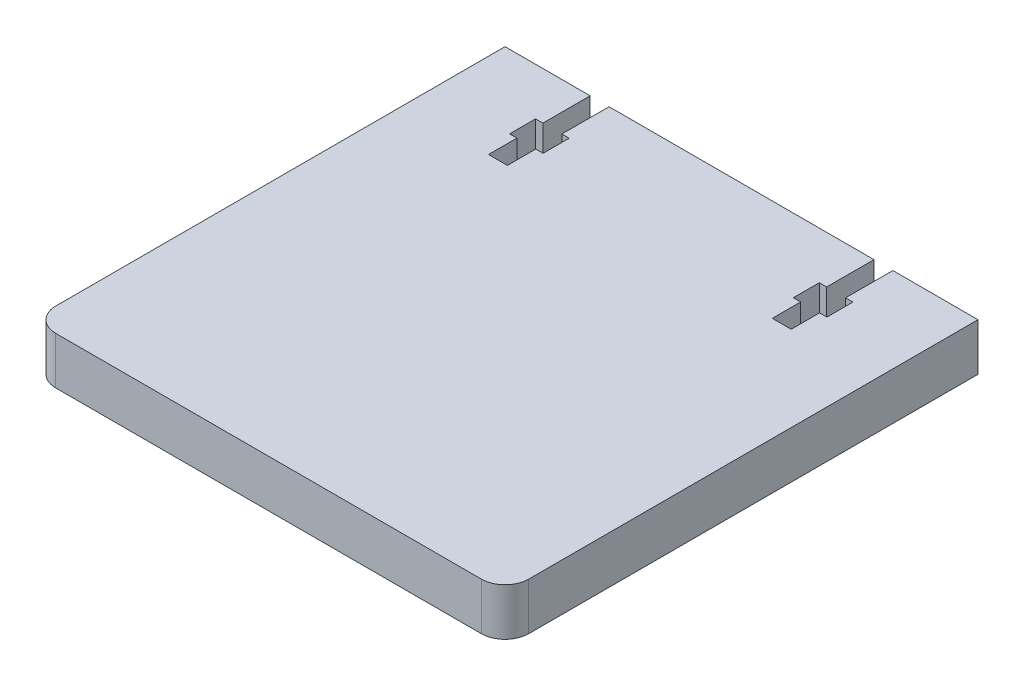
ISO-10303-21;
HEADER;
FILE_DESCRIPTION(('STEP AP214'),'2;1');
FILE_NAME('part.step','',(''),(''),'','','');
FILE_SCHEMA(('AUTOMOTIVE_DESIGN { 1 0 10303 214 1 1 1 1 }'));
ENDSEC;
DATA;
#1=APPLICATION_CONTEXT('core data for automotive mechanical design processes');
#2=APPLICATION_PROTOCOL_DEFINITION('international standard','automotive_design',2000,#1);
#3=PRODUCT_CONTEXT('',#1,'mechanical');
#4=PRODUCT('Part','Part','',(#3));
#5=PRODUCT_RELATED_PRODUCT_CATEGORY('part','',(#4));
#6=PRODUCT_DEFINITION_FORMATION('','',#4);
#7=PRODUCT_DEFINITION_CONTEXT('part definition',#1,'design');
#8=PRODUCT_DEFINITION('design','',#6,#7);
#9=PRODUCT_DEFINITION_SHAPE('','',#8);
#10=(LENGTH_UNIT() NAMED_UNIT(*) SI_UNIT(.MILLI.,.METRE.));
#11=(NAMED_UNIT(*) PLANE_ANGLE_UNIT() SI_UNIT($,.RADIAN.));
#12=(NAMED_UNIT(*) SI_UNIT($,.STERADIAN.) SOLID_ANGLE_UNIT());
#13=UNCERTAINTY_MEASURE_WITH_UNIT(LENGTH_MEASURE(1.E-05),#10,'distance_accuracy_value','');
#14=(GEOMETRIC_REPRESENTATION_CONTEXT(3) GLOBAL_UNCERTAINTY_ASSIGNED_CONTEXT((#13)) GLOBAL_UNIT_ASSIGNED_CONTEXT((#10,
#11,#12)) REPRESENTATION_CONTEXT('',''));
#15=CARTESIAN_POINT('',(0.,0.,0.));
#16=DIRECTION('',(0.,0.,1.));
#17=DIRECTION('',(1.,0.,0.));
#18=AXIS2_PLACEMENT_3D('',#15,#16,#17);
#19=CARTESIAN_POINT('',(0.,0.,100.));
#20=DIRECTION('',(0.,1.,0.));
#21=DIRECTION('',(0.,0.,1.));
#22=AXIS2_PLACEMENT_3D('',#19,#20,#21);
#23=PLANE('',#22);
#24=DIRECTION('',(0.,0.,-1.));
#25=VECTOR('',#24,1.);
#26=CARTESIAN_POINT('',(100.,0.,100.));
#27=LINE('',#26,#25);
#28=CARTESIAN_POINT('',(100.,0.,95.));
#29=VERTEX_POINT('',#28);
#30=CARTESIAN_POINT('',(100.,0.,0.));
#31=VERTEX_POINT('',#30);
#32=EDGE_CURVE('E424',#29,#31,#27,.T.);
#33=ORIENTED_EDGE('',*,*,#32,.F.);
#34=CARTESIAN_POINT('',(95.,0.,95.));
#35=DIRECTION('',(0.,1.,0.));
#36=DIRECTION('',(0.,0.,1.));
#37=AXIS2_PLACEMENT_3D('',#34,#35,#36);
#38=CIRCLE('',#37,5.);
#39=CARTESIAN_POINT('',(95.,0.,100.));
#40=VERTEX_POINT('',#39);
#41=EDGE_CURVE('E12',#29,#40,#38,.F.);
#42=ORIENTED_EDGE('',*,*,#41,.T.);
#43=DIRECTION('',(1.,0.,0.));
#44=VECTOR('',#43,1.);
#45=CARTESIAN_POINT('',(0.,0.,100.));
#46=LINE('',#45,#44);
#47=CARTESIAN_POINT('',(5.,0.,100.));
#48=VERTEX_POINT('',#47);
#49=EDGE_CURVE('E417',#48,#40,#46,.T.);
#50=ORIENTED_EDGE('',*,*,#49,.F.);
#51=CARTESIAN_POINT('',(5.,0.,95.));
#52=DIRECTION('',(0.,1.,0.));
#53=DIRECTION('',(0.,0.,1.));
#54=AXIS2_PLACEMENT_3D('',#51,#52,#53);
#55=CIRCLE('',#54,5.);
#56=CARTESIAN_POINT('',(0.,0.,95.));
#57=VERTEX_POINT('',#56);
#58=EDGE_CURVE('E435',#48,#57,#55,.F.);
#59=ORIENTED_EDGE('',*,*,#58,.T.);
#60=DIRECTION('',(0.,0.,-1.));
#61=VECTOR('',#60,1.);
#62=CARTESIAN_POINT('',(0.,0.,100.));
#63=LINE('',#62,#61);
#64=CARTESIAN_POINT('',(0.,0.,0.));
#65=VERTEX_POINT('',#64);
#66=EDGE_CURVE('E427',#57,#65,#63,.T.);
#67=ORIENTED_EDGE('',*,*,#66,.T.);
#68=DIRECTION('',(1.,0.,0.));
#69=VECTOR('',#68,1.);
#70=CARTESIAN_POINT('',(0.,0.,0.));
#71=LINE('',#70,#69);
#72=CARTESIAN_POINT('',(18.,0.,0.));
#73=VERTEX_POINT('',#72);
#74=EDGE_CURVE('E297',#65,#73,#71,.T.);
#75=ORIENTED_EDGE('',*,*,#74,.T.);
#76=DIRECTION('',(0.,0.,1.));
#77=VECTOR('',#76,1.);
#78=CARTESIAN_POINT('',(18.,0.,0.));
#79=LINE('',#78,#77);
#80=CARTESIAN_POINT('',(18.,0.,10.));
#81=VERTEX_POINT('',#80);
#82=EDGE_CURVE('E259',#73,#81,#79,.T.);
#83=ORIENTED_EDGE('',*,*,#82,.T.);
#84=DIRECTION('',(-1.,0.,0.));
#85=VECTOR('',#84,1.);
#86=CARTESIAN_POINT('',(0.,0.,9.99999999999998));
#87=LINE('',#86,#85);
#88=CARTESIAN_POINT('',(16.45,0.,10.));
#89=VERTEX_POINT('',#88);
#90=EDGE_CURVE('E262',#81,#89,#87,.T.);
#91=ORIENTED_EDGE('',*,*,#90,.T.);
#92=DIRECTION('',(0.,0.,1.));
#93=VECTOR('',#92,1.);
#94=CARTESIAN_POINT('',(16.45,0.,0.));
#95=LINE('',#94,#93);
#96=CARTESIAN_POINT('',(16.45,0.,15.5));
#97=VERTEX_POINT('',#96);
#98=EDGE_CURVE('E659',#89,#97,#95,.T.);
#99=ORIENTED_EDGE('',*,*,#98,.T.);
#100=DIRECTION('',(1.,0.,0.));
#101=VECTOR('',#100,1.);
#102=CARTESIAN_POINT('',(0.,0.,15.5));
#103=LINE('',#102,#101);
#104=CARTESIAN_POINT('',(18.,0.,15.5));
#105=VERTEX_POINT('',#104);
#106=EDGE_CURVE('E660',#97,#105,#103,.T.);
#107=ORIENTED_EDGE('',*,*,#106,.T.);
#108=DIRECTION('',(0.,0.,1.));
#109=VECTOR('',#108,1.);
#110=CARTESIAN_POINT('',(18.,0.,0.));
#111=LINE('',#110,#109);
#112=CARTESIAN_POINT('',(18.,0.,21.5));
#113=VERTEX_POINT('',#112);
#114=EDGE_CURVE('E662',#105,#113,#111,.T.);
#115=ORIENTED_EDGE('',*,*,#114,.T.);
#116=DIRECTION('',(1.,0.,0.));
#117=VECTOR('',#116,1.);
#118=CARTESIAN_POINT('',(0.,0.,21.5));
#119=LINE('',#118,#117);
#120=CARTESIAN_POINT('',(22.,0.,21.5));
#121=VERTEX_POINT('',#120);
#122=EDGE_CURVE('E674',#113,#121,#119,.T.);
#123=ORIENTED_EDGE('',*,*,#122,.T.);
#124=DIRECTION('',(0.,0.,1.));
#125=VECTOR('',#124,1.);
#126=CARTESIAN_POINT('',(22.,0.,0.));
#127=LINE('',#126,#125);
#128=CARTESIAN_POINT('',(22.,0.,15.5));
#129=VERTEX_POINT('',#128);
#130=EDGE_CURVE('E678',#129,#121,#127,.T.);
#131=ORIENTED_EDGE('',*,*,#130,.F.);
#132=DIRECTION('',(-1.,0.,0.));
#133=VECTOR('',#132,1.);
#134=CARTESIAN_POINT('',(0.,0.,15.5));
#135=LINE('',#134,#133);
#136=CARTESIAN_POINT('',(23.55,0.,15.5));
#137=VERTEX_POINT('',#136);
#138=EDGE_CURVE('E682',#137,#129,#135,.T.);
#139=ORIENTED_EDGE('',*,*,#138,.F.);
#140=DIRECTION('',(0.,0.,1.));
#141=VECTOR('',#140,1.);
#142=CARTESIAN_POINT('',(23.55,0.,0.));
#143=LINE('',#142,#141);
#144=CARTESIAN_POINT('',(23.55,0.,10.));
#145=VERTEX_POINT('',#144);
#146=EDGE_CURVE('E685',#145,#137,#143,.T.);
#147=ORIENTED_EDGE('',*,*,#146,.F.);
#148=DIRECTION('',(1.,0.,0.));
#149=VECTOR('',#148,1.);
#150=CARTESIAN_POINT('',(0.,0.,10.));
#151=LINE('',#150,#149);
#152=CARTESIAN_POINT('',(22.,0.,10.));
#153=VERTEX_POINT('',#152);
#154=EDGE_CURVE('E286',#153,#145,#151,.T.);
#155=ORIENTED_EDGE('',*,*,#154,.F.);
#156=DIRECTION('',(0.,0.,1.));
#157=VECTOR('',#156,1.);
#158=CARTESIAN_POINT('',(22.,0.,0.));
#159=LINE('',#158,#157);
#160=CARTESIAN_POINT('',(22.,0.,0.));
#161=VERTEX_POINT('',#160);
#162=EDGE_CURVE('E240',#161,#153,#159,.T.);
#163=ORIENTED_EDGE('',*,*,#162,.F.);
#164=CARTESIAN_POINT('',(78.,0.,0.));
#165=VERTEX_POINT('',#164);
#166=EDGE_CURVE('E303',#161,#165,#71,.T.);
#167=ORIENTED_EDGE('',*,*,#166,.T.);
#168=DIRECTION('',(0.,0.,1.));
#169=VECTOR('',#168,1.);
#170=CARTESIAN_POINT('',(78.,0.,0.));
#171=LINE('',#170,#169);
#172=CARTESIAN_POINT('',(78.,0.,10.));
#173=VERTEX_POINT('',#172);
#174=EDGE_CURVE('E482',#165,#173,#171,.T.);
#175=ORIENTED_EDGE('',*,*,#174,.T.);
#176=DIRECTION('',(-1.,0.,0.));
#177=VECTOR('',#176,1.);
#178=CARTESIAN_POINT('',(0.,0.,9.99999999999991));
#179=LINE('',#178,#177);
#180=CARTESIAN_POINT('',(76.45,0.,10.));
#181=VERTEX_POINT('',#180);
#182=EDGE_CURVE('E485',#173,#181,#179,.T.);
#183=ORIENTED_EDGE('',*,*,#182,.T.);
#184=DIRECTION('',(0.,0.,1.));
#185=VECTOR('',#184,1.);
#186=CARTESIAN_POINT('',(76.45,0.,-1.92901250528621E-13));
#187=LINE('',#186,#185);
#188=CARTESIAN_POINT('',(76.45,0.,15.5));
#189=VERTEX_POINT('',#188);
#190=EDGE_CURVE('E493',#181,#189,#187,.T.);
#191=ORIENTED_EDGE('',*,*,#190,.T.);
#192=DIRECTION('',(1.,0.,0.));
#193=VECTOR('',#192,1.);
#194=CARTESIAN_POINT('',(0.,0.,15.5));
#195=LINE('',#194,#193);
#196=CARTESIAN_POINT('',(78.,0.,15.5));
#197=VERTEX_POINT('',#196);
#198=EDGE_CURVE('E498',#189,#197,#195,.T.);
#199=ORIENTED_EDGE('',*,*,#198,.T.);
#200=DIRECTION('',(0.,0.,1.));
#201=VECTOR('',#200,1.);
#202=CARTESIAN_POINT('',(78.,0.,0.));
#203=LINE('',#202,#201);
#204=CARTESIAN_POINT('',(78.,0.,21.5));
#205=VERTEX_POINT('',#204);
#206=EDGE_CURVE('E501',#197,#205,#203,.T.);
#207=ORIENTED_EDGE('',*,*,#206,.T.);
#208=DIRECTION('',(-1.,0.,0.));
#209=VECTOR('',#208,1.);
#210=CARTESIAN_POINT('',(0.,0.,21.5));
#211=LINE('',#210,#209);
#212=CARTESIAN_POINT('',(82.,0.,21.5));
#213=VERTEX_POINT('',#212);
#214=EDGE_CURVE('E377',#213,#205,#211,.T.);
#215=ORIENTED_EDGE('',*,*,#214,.F.);
#216=DIRECTION('',(0.,0.,1.));
#217=VECTOR('',#216,1.);
#218=CARTESIAN_POINT('',(82.,0.,0.));
#219=LINE('',#218,#217);
#220=CARTESIAN_POINT('',(82.,0.,15.5));
#221=VERTEX_POINT('',#220);
#222=EDGE_CURVE('E373',#221,#213,#219,.T.);
#223=ORIENTED_EDGE('',*,*,#222,.F.);
#224=DIRECTION('',(-1.,0.,0.));
#225=VECTOR('',#224,1.);
#226=CARTESIAN_POINT('',(0.,0.,15.5));
#227=LINE('',#226,#225);
#228=CARTESIAN_POINT('',(83.55,0.,15.5));
#229=VERTEX_POINT('',#228);
#230=EDGE_CURVE('E347',#229,#221,#227,.T.);
#231=ORIENTED_EDGE('',*,*,#230,.F.);
#232=DIRECTION('',(0.,0.,1.));
#233=VECTOR('',#232,1.);
#234=CARTESIAN_POINT('',(83.55,0.,2.10816212971436E-13));
#235=LINE('',#234,#233);
#236=CARTESIAN_POINT('',(83.55,0.,10.));
#237=VERTEX_POINT('',#236);
#238=EDGE_CURVE('E391',#237,#229,#235,.T.);
#239=ORIENTED_EDGE('',*,*,#238,.F.);
#240=DIRECTION('',(1.,0.,0.));
#241=VECTOR('',#240,1.);
#242=CARTESIAN_POINT('',(0.,0.,10.0000000000001));
#243=LINE('',#242,#241);
#244=CARTESIAN_POINT('',(82.,0.,10.));
#245=VERTEX_POINT('',#244);
#246=EDGE_CURVE('E481',#245,#237,#243,.T.);
#247=ORIENTED_EDGE('',*,*,#246,.F.);
#248=DIRECTION('',(0.,0.,1.));
#249=VECTOR('',#248,1.);
#250=CARTESIAN_POINT('',(82.,0.,1.13797860024079E-13));
#251=LINE('',#250,#249);
#252=CARTESIAN_POINT('',(82.,0.,0.));
#253=VERTEX_POINT('',#252);
#254=EDGE_CURVE('E476',#253,#245,#251,.T.);
#255=ORIENTED_EDGE('',*,*,#254,.F.);
#256=EDGE_CURVE('E304',#253,#31,#71,.T.);
#257=ORIENTED_EDGE('',*,*,#256,.T.);
#258=EDGE_LOOP('',(#33,#42,#50,#59,#67,#75,#83,#91,#99,#107,#115,#123,#131,#139,#147,#155,#163,
#167,#175,#183,#191,#199,#207,#215,#223,#231,#239,#247,#255,#257));
#259=FACE_BOUND('',#258,.T.);
#260=ADVANCED_FACE('F39',(#259),#23,.F.);
#261=CARTESIAN_POINT('',(0.,10.,100.));
#262=DIRECTION('',(0.,-1.,0.));
#263=DIRECTION('',(0.,0.,-1.));
#264=AXIS2_PLACEMENT_3D('',#261,#262,#263);
#265=PLANE('',#264);
#266=DIRECTION('',(-1.,0.,0.));
#267=VECTOR('',#266,1.);
#268=CARTESIAN_POINT('',(0.,10.,100.));
#269=LINE('',#268,#267);
#270=CARTESIAN_POINT('',(95.,10.,100.));
#271=VERTEX_POINT('',#270);
#272=CARTESIAN_POINT('',(5.,10.,100.));
#273=VERTEX_POINT('',#272);
#274=EDGE_CURVE('E420',#271,#273,#269,.T.);
#275=ORIENTED_EDGE('',*,*,#274,.F.);
#276=CARTESIAN_POINT('',(95.,10.,95.));
#277=DIRECTION('',(0.,-1.,0.));
#278=DIRECTION('',(0.,0.,-1.));
#279=AXIS2_PLACEMENT_3D('',#276,#277,#278);
#280=CIRCLE('',#279,5.);
#281=CARTESIAN_POINT('',(100.,10.,95.));
#282=VERTEX_POINT('',#281);
#283=EDGE_CURVE('E61',#271,#282,#280,.F.);
#284=ORIENTED_EDGE('',*,*,#283,.T.);
#285=DIRECTION('',(0.,0.,-1.));
#286=VECTOR('',#285,1.);
#287=CARTESIAN_POINT('',(100.,10.,100.));
#288=LINE('',#287,#286);
#289=CARTESIAN_POINT('',(100.,10.,0.));
#290=VERTEX_POINT('',#289);
#291=EDGE_CURVE('E428',#282,#290,#288,.T.);
#292=ORIENTED_EDGE('',*,*,#291,.T.);
#293=DIRECTION('',(-1.,0.,0.));
#294=VECTOR('',#293,1.);
#295=CARTESIAN_POINT('',(0.,10.,0.));
#296=LINE('',#295,#294);
#297=CARTESIAN_POINT('',(82.,10.,0.));
#298=VERTEX_POINT('',#297);
#299=EDGE_CURVE('E421',#290,#298,#296,.T.);
#300=ORIENTED_EDGE('',*,*,#299,.T.);
#301=DIRECTION('',(0.,0.,1.));
#302=VECTOR('',#301,1.);
#303=CARTESIAN_POINT('',(82.,10.,1.13797860024079E-13));
#304=LINE('',#303,#302);
#305=CARTESIAN_POINT('',(82.,10.,10.));
#306=VERTEX_POINT('',#305);
#307=EDGE_CURVE('E360',#298,#306,#304,.T.);
#308=ORIENTED_EDGE('',*,*,#307,.T.);
#309=DIRECTION('',(1.,0.,0.));
#310=VECTOR('',#309,1.);
#311=CARTESIAN_POINT('',(0.,10.,10.0000000000001));
#312=LINE('',#311,#310);
#313=CARTESIAN_POINT('',(83.55,10.,10.));
#314=VERTEX_POINT('',#313);
#315=EDGE_CURVE('E363',#306,#314,#312,.T.);
#316=ORIENTED_EDGE('',*,*,#315,.T.);
#317=DIRECTION('',(0.,0.,1.));
#318=VECTOR('',#317,1.);
#319=CARTESIAN_POINT('',(83.55,10.,2.10816212971436E-13));
#320=LINE('',#319,#318);
#321=CARTESIAN_POINT('',(83.55,10.,15.5));
#322=VERTEX_POINT('',#321);
#323=EDGE_CURVE('E366',#314,#322,#320,.T.);
#324=ORIENTED_EDGE('',*,*,#323,.T.);
#325=DIRECTION('',(-1.,0.,0.));
#326=VECTOR('',#325,1.);
#327=CARTESIAN_POINT('',(0.,10.,15.5));
#328=LINE('',#327,#326);
#329=CARTESIAN_POINT('',(82.,10.,15.5));
#330=VERTEX_POINT('',#329);
#331=EDGE_CURVE('E369',#322,#330,#328,.T.);
#332=ORIENTED_EDGE('',*,*,#331,.T.);
#333=DIRECTION('',(0.,0.,1.));
#334=VECTOR('',#333,1.);
#335=CARTESIAN_POINT('',(82.,10.,0.));
#336=LINE('',#335,#334);
#337=CARTESIAN_POINT('',(82.,10.,21.5));
#338=VERTEX_POINT('',#337);
#339=EDGE_CURVE('E343',#330,#338,#336,.T.);
#340=ORIENTED_EDGE('',*,*,#339,.T.);
#341=DIRECTION('',(-1.,0.,0.));
#342=VECTOR('',#341,1.);
#343=CARTESIAN_POINT('',(0.,10.,21.5));
#344=LINE('',#343,#342);
#345=CARTESIAN_POINT('',(78.,10.,21.5));
#346=VERTEX_POINT('',#345);
#347=EDGE_CURVE('E346',#338,#346,#344,.T.);
#348=ORIENTED_EDGE('',*,*,#347,.T.);
#349=DIRECTION('',(0.,0.,1.));
#350=VECTOR('',#349,1.);
#351=CARTESIAN_POINT('',(78.,10.,0.));
#352=LINE('',#351,#350);
#353=CARTESIAN_POINT('',(78.,10.,15.5));
#354=VERTEX_POINT('',#353);
#355=EDGE_CURVE('E350',#354,#346,#352,.T.);
#356=ORIENTED_EDGE('',*,*,#355,.F.);
#357=DIRECTION('',(1.,0.,0.));
#358=VECTOR('',#357,1.);
#359=CARTESIAN_POINT('',(0.,10.,15.5));
#360=LINE('',#359,#358);
#361=CARTESIAN_POINT('',(76.45,10.,15.5));
#362=VERTEX_POINT('',#361);
#363=EDGE_CURVE('E352',#362,#354,#360,.T.);
#364=ORIENTED_EDGE('',*,*,#363,.F.);
#365=DIRECTION('',(0.,0.,1.));
#366=VECTOR('',#365,1.);
#367=CARTESIAN_POINT('',(76.45,10.,-1.92901250528621E-13));
#368=LINE('',#367,#366);
#369=CARTESIAN_POINT('',(76.45,10.,10.));
#370=VERTEX_POINT('',#369);
#371=EDGE_CURVE('E354',#370,#362,#368,.T.);
#372=ORIENTED_EDGE('',*,*,#371,.F.);
#373=DIRECTION('',(-1.,0.,0.));
#374=VECTOR('',#373,1.);
#375=CARTESIAN_POINT('',(0.,10.,9.99999999999991));
#376=LINE('',#375,#374);
#377=CARTESIAN_POINT('',(78.,10.,10.));
#378=VERTEX_POINT('',#377);
#379=EDGE_CURVE('E356',#378,#370,#376,.T.);
#380=ORIENTED_EDGE('',*,*,#379,.F.);
#381=DIRECTION('',(0.,0.,1.));
#382=VECTOR('',#381,1.);
#383=CARTESIAN_POINT('',(78.,10.,0.));
#384=LINE('',#383,#382);
#385=CARTESIAN_POINT('',(78.,10.,0.));
#386=VERTEX_POINT('',#385);
#387=EDGE_CURVE('E358',#386,#378,#384,.T.);
#388=ORIENTED_EDGE('',*,*,#387,.F.);
#389=CARTESIAN_POINT('',(22.,10.,0.));
#390=VERTEX_POINT('',#389);
#391=EDGE_CURVE('E258',#386,#390,#296,.T.);
#392=ORIENTED_EDGE('',*,*,#391,.T.);
#393=DIRECTION('',(0.,0.,1.));
#394=VECTOR('',#393,1.);
#395=CARTESIAN_POINT('',(22.,10.,0.));
#396=LINE('',#395,#394);
#397=CARTESIAN_POINT('',(22.,10.,10.));
#398=VERTEX_POINT('',#397);
#399=EDGE_CURVE('E237',#390,#398,#396,.T.);
#400=ORIENTED_EDGE('',*,*,#399,.T.);
#401=DIRECTION('',(1.,0.,0.));
#402=VECTOR('',#401,1.);
#403=CARTESIAN_POINT('',(0.,10.,10.));
#404=LINE('',#403,#402);
#405=CARTESIAN_POINT('',(23.55,10.,10.));
#406=VERTEX_POINT('',#405);
#407=EDGE_CURVE('E248',#398,#406,#404,.T.);
#408=ORIENTED_EDGE('',*,*,#407,.T.);
#409=DIRECTION('',(0.,0.,1.));
#410=VECTOR('',#409,1.);
#411=CARTESIAN_POINT('',(23.55,10.,0.));
#412=LINE('',#411,#410);
#413=CARTESIAN_POINT('',(23.55,10.,15.5));
#414=VERTEX_POINT('',#413);
#415=EDGE_CURVE('E252',#406,#414,#412,.T.);
#416=ORIENTED_EDGE('',*,*,#415,.T.);
#417=DIRECTION('',(-1.,0.,0.));
#418=VECTOR('',#417,1.);
#419=CARTESIAN_POINT('',(0.,10.,15.5));
#420=LINE('',#419,#418);
#421=CARTESIAN_POINT('',(22.,10.,15.5));
#422=VERTEX_POINT('',#421);
#423=EDGE_CURVE('E266',#414,#422,#420,.T.);
#424=ORIENTED_EDGE('',*,*,#423,.T.);
#425=DIRECTION('',(0.,0.,1.));
#426=VECTOR('',#425,1.);
#427=CARTESIAN_POINT('',(22.,10.,0.));
#428=LINE('',#427,#426);
#429=CARTESIAN_POINT('',(22.,10.,21.5));
#430=VERTEX_POINT('',#429);
#431=EDGE_CURVE('E269',#422,#430,#428,.T.);
#432=ORIENTED_EDGE('',*,*,#431,.T.);
#433=DIRECTION('',(1.,0.,0.));
#434=VECTOR('',#433,1.);
#435=CARTESIAN_POINT('',(0.,10.,21.5));
#436=LINE('',#435,#434);
#437=CARTESIAN_POINT('',(18.,10.,21.5));
#438=VERTEX_POINT('',#437);
#439=EDGE_CURVE('E272',#438,#430,#436,.T.);
#440=ORIENTED_EDGE('',*,*,#439,.F.);
#441=DIRECTION('',(0.,0.,1.));
#442=VECTOR('',#441,1.);
#443=CARTESIAN_POINT('',(18.,10.,0.));
#444=LINE('',#443,#442);
#445=CARTESIAN_POINT('',(18.,10.,15.5));
#446=VERTEX_POINT('',#445);
#447=EDGE_CURVE('E274',#446,#438,#444,.T.);
#448=ORIENTED_EDGE('',*,*,#447,.F.);
#449=DIRECTION('',(1.,0.,0.));
#450=VECTOR('',#449,1.);
#451=CARTESIAN_POINT('',(0.,10.,15.5));
#452=LINE('',#451,#450);
#453=CARTESIAN_POINT('',(16.45,10.,15.5));
#454=VERTEX_POINT('',#453);
#455=EDGE_CURVE('E276',#454,#446,#452,.T.);
#456=ORIENTED_EDGE('',*,*,#455,.F.);
#457=DIRECTION('',(0.,0.,1.));
#458=VECTOR('',#457,1.);
#459=CARTESIAN_POINT('',(16.45,10.,0.));
#460=LINE('',#459,#458);
#461=CARTESIAN_POINT('',(16.45,10.,10.));
#462=VERTEX_POINT('',#461);
#463=EDGE_CURVE('E278',#462,#454,#460,.T.);
#464=ORIENTED_EDGE('',*,*,#463,.F.);
#465=DIRECTION('',(-1.,0.,0.));
#466=VECTOR('',#465,1.);
#467=CARTESIAN_POINT('',(0.,10.,9.99999999999998));
#468=LINE('',#467,#466);
#469=CARTESIAN_POINT('',(18.,10.,10.));
#470=VERTEX_POINT('',#469);
#471=EDGE_CURVE('E280',#470,#462,#468,.T.);
#472=ORIENTED_EDGE('',*,*,#471,.F.);
#473=DIRECTION('',(0.,0.,1.));
#474=VECTOR('',#473,1.);
#475=CARTESIAN_POINT('',(18.,10.,0.));
#476=LINE('',#475,#474);
#477=CARTESIAN_POINT('',(18.,10.,0.));
#478=VERTEX_POINT('',#477);
#479=EDGE_CURVE('E282',#478,#470,#476,.T.);
#480=ORIENTED_EDGE('',*,*,#479,.F.);
#481=CARTESIAN_POINT('',(0.,10.,0.));
#482=VERTEX_POINT('',#481);
#483=EDGE_CURVE('E459',#478,#482,#296,.T.);
#484=ORIENTED_EDGE('',*,*,#483,.T.);
#485=DIRECTION('',(0.,0.,-1.));
#486=VECTOR('',#485,1.);
#487=CARTESIAN_POINT('',(0.,10.,100.));
#488=LINE('',#487,#486);
#489=CARTESIAN_POINT('',(0.,10.,95.));
#490=VERTEX_POINT('',#489);
#491=EDGE_CURVE('E454',#490,#482,#488,.T.);
#492=ORIENTED_EDGE('',*,*,#491,.F.);
#493=CARTESIAN_POINT('',(5.,10.,95.));
#494=DIRECTION('',(0.,-1.,0.));
#495=DIRECTION('',(0.,0.,-1.));
#496=AXIS2_PLACEMENT_3D('',#493,#494,#495);
#497=CIRCLE('',#496,5.);
#498=EDGE_CURVE('E439',#490,#273,#497,.F.);
#499=ORIENTED_EDGE('',*,*,#498,.T.);
#500=EDGE_LOOP('',(#275,#284,#292,#300,#308,#316,#324,#332,#340,#348,#356,#364,#372,#380,#388,
#392,#400,#408,#416,#424,#432,#440,#448,#456,#464,#472,#480,#484,#492,#499));
#501=FACE_BOUND('',#500,.T.);
#502=ADVANCED_FACE('F255',(#501),#265,.F.);
#503=CARTESIAN_POINT('',(0.,0.,0.));
#504=DIRECTION('',(0.,0.,-1.));
#505=DIRECTION('',(-1.,0.,0.));
#506=AXIS2_PLACEMENT_3D('',#503,#504,#505);
#507=PLANE('',#506);
#508=ORIENTED_EDGE('',*,*,#483,.F.);
#509=DIRECTION('',(0.,-1.,0.));
#510=VECTOR('',#509,1.);
#511=CARTESIAN_POINT('',(18.,10.,0.));
#512=LINE('',#511,#510);
#513=EDGE_CURVE('E322',#478,#73,#512,.T.);
#514=ORIENTED_EDGE('',*,*,#513,.T.);
#515=ORIENTED_EDGE('',*,*,#74,.F.);
#516=DIRECTION('',(0.,-1.,0.));
#517=VECTOR('',#516,1.);
#518=CARTESIAN_POINT('',(0.,0.,0.));
#519=LINE('',#518,#517);
#520=EDGE_CURVE('E305',#482,#65,#519,.T.);
#521=ORIENTED_EDGE('',*,*,#520,.F.);
#522=EDGE_LOOP('',(#508,#514,#515,#521));
#523=FACE_BOUND('',#522,.T.);
#524=ADVANCED_FACE('F557',(#523),#507,.T.);
#525=DIRECTION('',(0.,-1.,0.));
#526=VECTOR('',#525,1.);
#527=CARTESIAN_POINT('',(22.,10.,0.));
#528=LINE('',#527,#526);
#529=EDGE_CURVE('E245',#390,#161,#528,.T.);
#530=ORIENTED_EDGE('',*,*,#529,.F.);
#531=ORIENTED_EDGE('',*,*,#391,.F.);
#532=DIRECTION('',(0.,-1.,0.));
#533=VECTOR('',#532,1.);
#534=CARTESIAN_POINT('',(78.,10.,0.));
#535=LINE('',#534,#533);
#536=EDGE_CURVE('E403',#386,#165,#535,.T.);
#537=ORIENTED_EDGE('',*,*,#536,.T.);
#538=ORIENTED_EDGE('',*,*,#166,.F.);
#539=EDGE_LOOP('',(#530,#531,#537,#538));
#540=FACE_BOUND('',#539,.T.);
#541=ADVANCED_FACE('F551',(#540),#507,.T.);
#542=CARTESIAN_POINT('',(0.,0.,100.));
#543=DIRECTION('',(1.,0.,0.));
#544=DIRECTION('',(0.,0.,-1.));
#545=AXIS2_PLACEMENT_3D('',#542,#543,#544);
#546=PLANE('',#545);
#547=ORIENTED_EDGE('',*,*,#66,.F.);
#548=DIRECTION('',(0.,-1.,0.));
#549=VECTOR('',#548,1.);
#550=CARTESIAN_POINT('',(0.,0.,95.));
#551=LINE('',#550,#549);
#552=EDGE_CURVE('E437',#57,#490,#551,.F.);
#553=ORIENTED_EDGE('',*,*,#552,.T.);
#554=ORIENTED_EDGE('',*,*,#491,.T.);
#555=ORIENTED_EDGE('',*,*,#520,.T.);
#556=EDGE_LOOP('',(#547,#553,#554,#555));
#557=FACE_BOUND('',#556,.T.);
#558=ADVANCED_FACE('F553',(#557),#546,.F.);
#559=CARTESIAN_POINT('',(100.,0.,100.));
#560=DIRECTION('',(-1.,0.,0.));
#561=DIRECTION('',(0.,0.,1.));
#562=AXIS2_PLACEMENT_3D('',#559,#560,#561);
#563=PLANE('',#562);
#564=ORIENTED_EDGE('',*,*,#291,.F.);
#565=DIRECTION('',(0.,1.,0.));
#566=VECTOR('',#565,1.);
#567=CARTESIAN_POINT('',(100.,0.,95.));
#568=LINE('',#567,#566);
#569=EDGE_CURVE('E47',#282,#29,#568,.F.);
#570=ORIENTED_EDGE('',*,*,#569,.T.);
#571=ORIENTED_EDGE('',*,*,#32,.T.);
#572=DIRECTION('',(0.,1.,0.));
#573=VECTOR('',#572,1.);
#574=CARTESIAN_POINT('',(100.,0.,0.));
#575=LINE('',#574,#573);
#576=EDGE_CURVE('E302',#31,#290,#575,.T.);
#577=ORIENTED_EDGE('',*,*,#576,.T.);
#578=EDGE_LOOP('',(#564,#570,#571,#577));
#579=FACE_BOUND('',#578,.T.);
#580=ADVANCED_FACE('F466',(#579),#563,.F.);
#581=CARTESIAN_POINT('',(0.,0.,100.));
#582=DIRECTION('',(0.,0.,-1.));
#583=DIRECTION('',(-1.,0.,0.));
#584=AXIS2_PLACEMENT_3D('',#581,#582,#583);
#585=PLANE('',#584);
#586=ORIENTED_EDGE('',*,*,#49,.T.);
#587=DIRECTION('',(0.,1.,0.));
#588=VECTOR('',#587,1.);
#589=CARTESIAN_POINT('',(95.,0.,100.));
#590=LINE('',#589,#588);
#591=EDGE_CURVE('E442',#40,#271,#590,.T.);
#592=ORIENTED_EDGE('',*,*,#591,.T.);
#593=ORIENTED_EDGE('',*,*,#274,.T.);
#594=DIRECTION('',(0.,-1.,0.));
#595=VECTOR('',#594,1.);
#596=CARTESIAN_POINT('',(5.,0.,100.));
#597=LINE('',#596,#595);
#598=EDGE_CURVE('E432',#273,#48,#597,.T.);
#599=ORIENTED_EDGE('',*,*,#598,.T.);
#600=EDGE_LOOP('',(#586,#592,#593,#599));
#601=FACE_BOUND('',#600,.T.);
#602=ADVANCED_FACE('F447',(#601),#585,.F.);
#603=DIRECTION('',(0.,-1.,0.));
#604=VECTOR('',#603,1.);
#605=CARTESIAN_POINT('',(82.,10.,0.));
#606=LINE('',#605,#604);
#607=EDGE_CURVE('E401',#298,#253,#606,.T.);
#608=ORIENTED_EDGE('',*,*,#607,.F.);
#609=ORIENTED_EDGE('',*,*,#299,.F.);
#610=ORIENTED_EDGE('',*,*,#576,.F.);
#611=ORIENTED_EDGE('',*,*,#256,.F.);
#612=EDGE_LOOP('',(#608,#609,#610,#611));
#613=FACE_BOUND('',#612,.T.);
#614=ADVANCED_FACE('F471',(#613),#507,.T.);
#615=CARTESIAN_POINT('',(82.,10.,0.));
#616=DIRECTION('',(1.,0.,0.));
#617=DIRECTION('',(0.,0.,-1.));
#618=AXIS2_PLACEMENT_3D('',#615,#616,#617);
#619=PLANE('',#618);
#620=ORIENTED_EDGE('',*,*,#222,.T.);
#621=DIRECTION('',(0.,-1.,0.));
#622=VECTOR('',#621,1.);
#623=CARTESIAN_POINT('',(82.,10.,21.5));
#624=LINE('',#623,#622);
#625=EDGE_CURVE('E372',#338,#213,#624,.T.);
#626=ORIENTED_EDGE('',*,*,#625,.F.);
#627=ORIENTED_EDGE('',*,*,#339,.F.);
#628=DIRECTION('',(0.,-1.,0.));
#629=VECTOR('',#628,1.);
#630=CARTESIAN_POINT('',(82.,10.,15.5));
#631=LINE('',#630,#629);
#632=EDGE_CURVE('E287',#330,#221,#631,.T.);
#633=ORIENTED_EDGE('',*,*,#632,.T.);
#634=EDGE_LOOP('',(#620,#626,#627,#633));
#635=FACE_BOUND('',#634,.T.);
#636=ADVANCED_FACE('F514',(#635),#619,.F.);
#637=CARTESIAN_POINT('',(0.,10.,15.5));
#638=DIRECTION('',(0.,0.,1.));
#639=DIRECTION('',(1.,0.,0.));
#640=AXIS2_PLACEMENT_3D('',#637,#638,#639);
#641=PLANE('',#640);
#642=ORIENTED_EDGE('',*,*,#230,.T.);
#643=ORIENTED_EDGE('',*,*,#632,.F.);
#644=ORIENTED_EDGE('',*,*,#331,.F.);
#645=DIRECTION('',(0.,-1.,0.));
#646=VECTOR('',#645,1.);
#647=CARTESIAN_POINT('',(83.55,10.,15.5));
#648=LINE('',#647,#646);
#649=EDGE_CURVE('E395',#322,#229,#648,.T.);
#650=ORIENTED_EDGE('',*,*,#649,.T.);
#651=EDGE_LOOP('',(#642,#643,#644,#650));
#652=FACE_BOUND('',#651,.T.);
#653=ADVANCED_FACE('F518',(#652),#641,.F.);
#654=CARTESIAN_POINT('',(83.55,10.,2.10816212971436E-13));
#655=DIRECTION('',(1.,0.,0.));
#656=DIRECTION('',(0.,0.,-1.));
#657=AXIS2_PLACEMENT_3D('',#654,#655,#656);
#658=PLANE('',#657);
#659=ORIENTED_EDGE('',*,*,#238,.T.);
#660=ORIENTED_EDGE('',*,*,#649,.F.);
#661=ORIENTED_EDGE('',*,*,#323,.F.);
#662=DIRECTION('',(0.,-1.,0.));
#663=VECTOR('',#662,1.);
#664=CARTESIAN_POINT('',(83.55,10.,10.));
#665=LINE('',#664,#663);
#666=EDGE_CURVE('E397',#314,#237,#665,.T.);
#667=ORIENTED_EDGE('',*,*,#666,.T.);
#668=EDGE_LOOP('',(#659,#660,#661,#667));
#669=FACE_BOUND('',#668,.T.);
#670=ADVANCED_FACE('F522',(#669),#658,.F.);
#671=CARTESIAN_POINT('',(0.,10.,10.0000000000001));
#672=DIRECTION('',(0.,0.,-1.));
#673=DIRECTION('',(-1.,0.,0.));
#674=AXIS2_PLACEMENT_3D('',#671,#672,#673);
#675=PLANE('',#674);
#676=ORIENTED_EDGE('',*,*,#246,.T.);
#677=ORIENTED_EDGE('',*,*,#666,.F.);
#678=ORIENTED_EDGE('',*,*,#315,.F.);
#679=DIRECTION('',(0.,-1.,0.));
#680=VECTOR('',#679,1.);
#681=CARTESIAN_POINT('',(82.,10.,10.));
#682=LINE('',#681,#680);
#683=EDGE_CURVE('E399',#306,#245,#682,.T.);
#684=ORIENTED_EDGE('',*,*,#683,.T.);
#685=EDGE_LOOP('',(#676,#677,#678,#684));
#686=FACE_BOUND('',#685,.T.);
#687=ADVANCED_FACE('F525',(#686),#675,.F.);
#688=CARTESIAN_POINT('',(82.,10.,1.13797860024079E-13));
#689=DIRECTION('',(1.,0.,0.));
#690=DIRECTION('',(0.,0.,-1.));
#691=AXIS2_PLACEMENT_3D('',#688,#689,#690);
#692=PLANE('',#691);
#693=ORIENTED_EDGE('',*,*,#254,.T.);
#694=ORIENTED_EDGE('',*,*,#683,.F.);
#695=ORIENTED_EDGE('',*,*,#307,.F.);
#696=ORIENTED_EDGE('',*,*,#607,.T.);
#697=EDGE_LOOP('',(#693,#694,#695,#696));
#698=FACE_BOUND('',#697,.T.);
#699=ADVANCED_FACE('F475',(#698),#692,.F.);
#700=CARTESIAN_POINT('',(78.,10.,0.));
#701=DIRECTION('',(1.,0.,0.));
#702=DIRECTION('',(0.,0.,-1.));
#703=AXIS2_PLACEMENT_3D('',#700,#701,#702);
#704=PLANE('',#703);
#705=ORIENTED_EDGE('',*,*,#174,.F.);
#706=ORIENTED_EDGE('',*,*,#536,.F.);
#707=ORIENTED_EDGE('',*,*,#387,.T.);
#708=DIRECTION('',(0.,-1.,0.));
#709=VECTOR('',#708,1.);
#710=CARTESIAN_POINT('',(78.,10.,10.));
#711=LINE('',#710,#709);
#712=EDGE_CURVE('E406',#378,#173,#711,.T.);
#713=ORIENTED_EDGE('',*,*,#712,.T.);
#714=EDGE_LOOP('',(#705,#706,#707,#713));
#715=FACE_BOUND('',#714,.T.);
#716=ADVANCED_FACE('F547',(#715),#704,.T.);
#717=CARTESIAN_POINT('',(0.,10.,9.99999999999991));
#718=DIRECTION('',(0.,0.,1.));
#719=DIRECTION('',(1.,0.,0.));
#720=AXIS2_PLACEMENT_3D('',#717,#718,#719);
#721=PLANE('',#720);
#722=ORIENTED_EDGE('',*,*,#182,.F.);
#723=ORIENTED_EDGE('',*,*,#712,.F.);
#724=ORIENTED_EDGE('',*,*,#379,.T.);
#725=DIRECTION('',(0.,-1.,0.));
#726=VECTOR('',#725,1.);
#727=CARTESIAN_POINT('',(76.45,10.,10.));
#728=LINE('',#727,#726);
#729=EDGE_CURVE('E408',#370,#181,#728,.T.);
#730=ORIENTED_EDGE('',*,*,#729,.T.);
#731=EDGE_LOOP('',(#722,#723,#724,#730));
#732=FACE_BOUND('',#731,.T.);
#733=ADVANCED_FACE('F545',(#732),#721,.T.);
#734=CARTESIAN_POINT('',(76.45,10.,-1.92901250528621E-13));
#735=DIRECTION('',(1.,0.,0.));
#736=DIRECTION('',(0.,0.,-1.));
#737=AXIS2_PLACEMENT_3D('',#734,#735,#736);
#738=PLANE('',#737);
#739=ORIENTED_EDGE('',*,*,#190,.F.);
#740=ORIENTED_EDGE('',*,*,#729,.F.);
#741=ORIENTED_EDGE('',*,*,#371,.T.);
#742=DIRECTION('',(0.,-1.,0.));
#743=VECTOR('',#742,1.);
#744=CARTESIAN_POINT('',(76.45,10.,15.5));
#745=LINE('',#744,#743);
#746=EDGE_CURVE('E410',#362,#189,#745,.T.);
#747=ORIENTED_EDGE('',*,*,#746,.T.);
#748=EDGE_LOOP('',(#739,#740,#741,#747));
#749=FACE_BOUND('',#748,.T.);
#750=ADVANCED_FACE('F539',(#749),#738,.T.);
#751=CARTESIAN_POINT('',(0.,10.,15.5));
#752=DIRECTION('',(0.,0.,-1.));
#753=DIRECTION('',(-1.,0.,0.));
#754=AXIS2_PLACEMENT_3D('',#751,#752,#753);
#755=PLANE('',#754);
#756=ORIENTED_EDGE('',*,*,#198,.F.);
#757=ORIENTED_EDGE('',*,*,#746,.F.);
#758=ORIENTED_EDGE('',*,*,#363,.T.);
#759=DIRECTION('',(0.,-1.,0.));
#760=VECTOR('',#759,1.);
#761=CARTESIAN_POINT('',(78.,10.,15.5));
#762=LINE('',#761,#760);
#763=EDGE_CURVE('E412',#354,#197,#762,.T.);
#764=ORIENTED_EDGE('',*,*,#763,.T.);
#765=EDGE_LOOP('',(#756,#757,#758,#764));
#766=FACE_BOUND('',#765,.T.);
#767=ADVANCED_FACE('F534',(#766),#755,.T.);
#768=CARTESIAN_POINT('',(78.,10.,0.));
#769=DIRECTION('',(1.,0.,0.));
#770=DIRECTION('',(0.,0.,-1.));
#771=AXIS2_PLACEMENT_3D('',#768,#769,#770);
#772=PLANE('',#771);
#773=ORIENTED_EDGE('',*,*,#206,.F.);
#774=ORIENTED_EDGE('',*,*,#763,.F.);
#775=ORIENTED_EDGE('',*,*,#355,.T.);
#776=DIRECTION('',(0.,-1.,0.));
#777=VECTOR('',#776,1.);
#778=CARTESIAN_POINT('',(78.,10.,21.5));
#779=LINE('',#778,#777);
#780=EDGE_CURVE('E414',#346,#205,#779,.T.);
#781=ORIENTED_EDGE('',*,*,#780,.T.);
#782=EDGE_LOOP('',(#773,#774,#775,#781));
#783=FACE_BOUND('',#782,.T.);
#784=ADVANCED_FACE('F531',(#783),#772,.T.);
#785=CARTESIAN_POINT('',(0.,10.,21.5));
#786=DIRECTION('',(0.,0.,1.));
#787=DIRECTION('',(1.,0.,0.));
#788=AXIS2_PLACEMENT_3D('',#785,#786,#787);
#789=PLANE('',#788);
#790=ORIENTED_EDGE('',*,*,#214,.T.);
#791=ORIENTED_EDGE('',*,*,#780,.F.);
#792=ORIENTED_EDGE('',*,*,#347,.F.);
#793=ORIENTED_EDGE('',*,*,#625,.T.);
#794=EDGE_LOOP('',(#790,#791,#792,#793));
#795=FACE_BOUND('',#794,.T.);
#796=ADVANCED_FACE('F509',(#795),#789,.F.);
#797=CARTESIAN_POINT('',(18.,10.,0.));
#798=DIRECTION('',(1.,0.,0.));
#799=DIRECTION('',(0.,0.,-1.));
#800=AXIS2_PLACEMENT_3D('',#797,#798,#799);
#801=PLANE('',#800);
#802=ORIENTED_EDGE('',*,*,#82,.F.);
#803=ORIENTED_EDGE('',*,*,#513,.F.);
#804=ORIENTED_EDGE('',*,*,#479,.T.);
#805=DIRECTION('',(0.,-1.,0.));
#806=VECTOR('',#805,1.);
#807=CARTESIAN_POINT('',(18.,10.,10.));
#808=LINE('',#807,#806);
#809=EDGE_CURVE('E325',#470,#81,#808,.T.);
#810=ORIENTED_EDGE('',*,*,#809,.T.);
#811=EDGE_LOOP('',(#802,#803,#804,#810));
#812=FACE_BOUND('',#811,.T.);
#813=ADVANCED_FACE('F596',(#812),#801,.T.);
#814=CARTESIAN_POINT('',(0.,10.,9.99999999999998));
#815=DIRECTION('',(0.,0.,1.));
#816=DIRECTION('',(1.,0.,0.));
#817=AXIS2_PLACEMENT_3D('',#814,#815,#816);
#818=PLANE('',#817);
#819=ORIENTED_EDGE('',*,*,#90,.F.);
#820=ORIENTED_EDGE('',*,*,#809,.F.);
#821=ORIENTED_EDGE('',*,*,#471,.T.);
#822=DIRECTION('',(0.,-1.,0.));
#823=VECTOR('',#822,1.);
#824=CARTESIAN_POINT('',(16.45,10.,10.));
#825=LINE('',#824,#823);
#826=EDGE_CURVE('E327',#462,#89,#825,.T.);
#827=ORIENTED_EDGE('',*,*,#826,.T.);
#828=EDGE_LOOP('',(#819,#820,#821,#827));
#829=FACE_BOUND('',#828,.T.);
#830=ADVANCED_FACE('F644',(#829),#818,.T.);
#831=CARTESIAN_POINT('',(16.45,10.,0.));
#832=DIRECTION('',(1.,0.,0.));
#833=DIRECTION('',(0.,0.,-1.));
#834=AXIS2_PLACEMENT_3D('',#831,#832,#833);
#835=PLANE('',#834);
#836=ORIENTED_EDGE('',*,*,#98,.F.);
#837=ORIENTED_EDGE('',*,*,#826,.F.);
#838=ORIENTED_EDGE('',*,*,#463,.T.);
#839=DIRECTION('',(0.,-1.,0.));
#840=VECTOR('',#839,1.);
#841=CARTESIAN_POINT('',(16.45,10.,15.5));
#842=LINE('',#841,#840);
#843=EDGE_CURVE('E329',#454,#97,#842,.T.);
#844=ORIENTED_EDGE('',*,*,#843,.T.);
#845=EDGE_LOOP('',(#836,#837,#838,#844));
#846=FACE_BOUND('',#845,.T.);
#847=ADVANCED_FACE('F640',(#846),#835,.T.);
#848=CARTESIAN_POINT('',(0.,10.,15.5));
#849=DIRECTION('',(0.,0.,-1.));
#850=DIRECTION('',(-1.,0.,0.));
#851=AXIS2_PLACEMENT_3D('',#848,#849,#850);
#852=PLANE('',#851);
#853=ORIENTED_EDGE('',*,*,#106,.F.);
#854=ORIENTED_EDGE('',*,*,#843,.F.);
#855=ORIENTED_EDGE('',*,*,#455,.T.);
#856=DIRECTION('',(0.,-1.,0.));
#857=VECTOR('',#856,1.);
#858=CARTESIAN_POINT('',(18.,10.,15.5));
#859=LINE('',#858,#857);
#860=EDGE_CURVE('E331',#446,#105,#859,.T.);
#861=ORIENTED_EDGE('',*,*,#860,.T.);
#862=EDGE_LOOP('',(#853,#854,#855,#861));
#863=FACE_BOUND('',#862,.T.);
#864=ADVANCED_FACE('F636',(#863),#852,.T.);
#865=CARTESIAN_POINT('',(18.,10.,0.));
#866=DIRECTION('',(1.,0.,0.));
#867=DIRECTION('',(0.,0.,-1.));
#868=AXIS2_PLACEMENT_3D('',#865,#866,#867);
#869=PLANE('',#868);
#870=ORIENTED_EDGE('',*,*,#114,.F.);
#871=ORIENTED_EDGE('',*,*,#860,.F.);
#872=ORIENTED_EDGE('',*,*,#447,.T.);
#873=DIRECTION('',(0.,-1.,0.));
#874=VECTOR('',#873,1.);
#875=CARTESIAN_POINT('',(18.,10.,21.5));
#876=LINE('',#875,#874);
#877=EDGE_CURVE('E333',#438,#113,#876,.T.);
#878=ORIENTED_EDGE('',*,*,#877,.T.);
#879=EDGE_LOOP('',(#870,#871,#872,#878));
#880=FACE_BOUND('',#879,.T.);
#881=ADVANCED_FACE('F632',(#880),#869,.T.);
#882=CARTESIAN_POINT('',(0.,10.,21.5));
#883=DIRECTION('',(0.,0.,-1.));
#884=DIRECTION('',(-1.,0.,0.));
#885=AXIS2_PLACEMENT_3D('',#882,#883,#884);
#886=PLANE('',#885);
#887=ORIENTED_EDGE('',*,*,#122,.F.);
#888=ORIENTED_EDGE('',*,*,#877,.F.);
#889=ORIENTED_EDGE('',*,*,#439,.T.);
#890=DIRECTION('',(0.,-1.,0.));
#891=VECTOR('',#890,1.);
#892=CARTESIAN_POINT('',(22.,10.,21.5));
#893=LINE('',#892,#891);
#894=EDGE_CURVE('E335',#430,#121,#893,.T.);
#895=ORIENTED_EDGE('',*,*,#894,.T.);
#896=EDGE_LOOP('',(#887,#888,#889,#895));
#897=FACE_BOUND('',#896,.T.);
#898=ADVANCED_FACE('F628',(#897),#886,.T.);
#899=CARTESIAN_POINT('',(22.,10.,0.));
#900=DIRECTION('',(1.,0.,0.));
#901=DIRECTION('',(0.,0.,-1.));
#902=AXIS2_PLACEMENT_3D('',#899,#900,#901);
#903=PLANE('',#902);
#904=ORIENTED_EDGE('',*,*,#130,.T.);
#905=ORIENTED_EDGE('',*,*,#894,.F.);
#906=ORIENTED_EDGE('',*,*,#431,.F.);
#907=DIRECTION('',(0.,-1.,0.));
#908=VECTOR('',#907,1.);
#909=CARTESIAN_POINT('',(22.,10.,15.5));
#910=LINE('',#909,#908);
#911=EDGE_CURVE('E337',#422,#129,#910,.T.);
#912=ORIENTED_EDGE('',*,*,#911,.T.);
#913=EDGE_LOOP('',(#904,#905,#906,#912));
#914=FACE_BOUND('',#913,.T.);
#915=ADVANCED_FACE('F624',(#914),#903,.F.);
#916=CARTESIAN_POINT('',(0.,10.,15.5));
#917=DIRECTION('',(0.,0.,1.));
#918=DIRECTION('',(1.,0.,0.));
#919=AXIS2_PLACEMENT_3D('',#916,#917,#918);
#920=PLANE('',#919);
#921=ORIENTED_EDGE('',*,*,#138,.T.);
#922=ORIENTED_EDGE('',*,*,#911,.F.);
#923=ORIENTED_EDGE('',*,*,#423,.F.);
#924=DIRECTION('',(0.,-1.,0.));
#925=VECTOR('',#924,1.);
#926=CARTESIAN_POINT('',(23.55,10.,15.5));
#927=LINE('',#926,#925);
#928=EDGE_CURVE('E339',#414,#137,#927,.T.);
#929=ORIENTED_EDGE('',*,*,#928,.T.);
#930=EDGE_LOOP('',(#921,#922,#923,#929));
#931=FACE_BOUND('',#930,.T.);
#932=ADVANCED_FACE('F620',(#931),#920,.F.);
#933=CARTESIAN_POINT('',(23.55,10.,0.));
#934=DIRECTION('',(1.,0.,0.));
#935=DIRECTION('',(0.,0.,-1.));
#936=AXIS2_PLACEMENT_3D('',#933,#934,#935);
#937=PLANE('',#936);
#938=ORIENTED_EDGE('',*,*,#146,.T.);
#939=ORIENTED_EDGE('',*,*,#928,.F.);
#940=ORIENTED_EDGE('',*,*,#415,.F.);
#941=DIRECTION('',(0.,-1.,0.));
#942=VECTOR('',#941,1.);
#943=CARTESIAN_POINT('',(23.55,10.,10.));
#944=LINE('',#943,#942);
#945=EDGE_CURVE('E244',#406,#145,#944,.T.);
#946=ORIENTED_EDGE('',*,*,#945,.T.);
#947=EDGE_LOOP('',(#938,#939,#940,#946));
#948=FACE_BOUND('',#947,.T.);
#949=ADVANCED_FACE('F617',(#948),#937,.F.);
#950=CARTESIAN_POINT('',(0.,10.,10.));
#951=DIRECTION('',(0.,0.,-1.));
#952=DIRECTION('',(-1.,0.,0.));
#953=AXIS2_PLACEMENT_3D('',#950,#951,#952);
#954=PLANE('',#953);
#955=ORIENTED_EDGE('',*,*,#154,.T.);
#956=ORIENTED_EDGE('',*,*,#945,.F.);
#957=ORIENTED_EDGE('',*,*,#407,.F.);
#958=DIRECTION('',(0.,-1.,0.));
#959=VECTOR('',#958,1.);
#960=CARTESIAN_POINT('',(22.,10.,10.));
#961=LINE('',#960,#959);
#962=EDGE_CURVE('E233',#398,#153,#961,.T.);
#963=ORIENTED_EDGE('',*,*,#962,.T.);
#964=EDGE_LOOP('',(#955,#956,#957,#963));
#965=FACE_BOUND('',#964,.T.);
#966=ADVANCED_FACE('F249',(#965),#954,.F.);
#967=CARTESIAN_POINT('',(22.,10.,0.));
#968=DIRECTION('',(1.,0.,0.));
#969=DIRECTION('',(0.,0.,-1.));
#970=AXIS2_PLACEMENT_3D('',#967,#968,#969);
#971=PLANE('',#970);
#972=ORIENTED_EDGE('',*,*,#162,.T.);
#973=ORIENTED_EDGE('',*,*,#962,.F.);
#974=ORIENTED_EDGE('',*,*,#399,.F.);
#975=ORIENTED_EDGE('',*,*,#529,.T.);
#976=EDGE_LOOP('',(#972,#973,#974,#975));
#977=FACE_BOUND('',#976,.T.);
#978=ADVANCED_FACE('F235',(#977),#971,.F.);
#979=CARTESIAN_POINT('',(5.,0.,95.));
#980=DIRECTION('',(0.,-1.,0.));
#981=DIRECTION('',(0.,0.,-1.));
#982=AXIS2_PLACEMENT_3D('',#979,#980,#981);
#983=CYLINDRICAL_SURFACE('',#982,5.);
#984=ORIENTED_EDGE('',*,*,#498,.F.);
#985=ORIENTED_EDGE('',*,*,#552,.F.);
#986=ORIENTED_EDGE('',*,*,#58,.F.);
#987=ORIENTED_EDGE('',*,*,#598,.F.);
#988=EDGE_LOOP('',(#984,#985,#986,#987));
#989=FACE_BOUND('',#988,.T.);
#990=ADVANCED_FACE('F560',(#989),#983,.T.);
#991=CARTESIAN_POINT('',(95.,0.,95.));
#992=DIRECTION('',(0.,1.,0.));
#993=DIRECTION('',(0.,0.,1.));
#994=AXIS2_PLACEMENT_3D('',#991,#992,#993);
#995=CYLINDRICAL_SURFACE('',#994,5.);
#996=ORIENTED_EDGE('',*,*,#41,.F.);
#997=ORIENTED_EDGE('',*,*,#569,.F.);
#998=ORIENTED_EDGE('',*,*,#283,.F.);
#999=ORIENTED_EDGE('',*,*,#591,.F.);
#1000=EDGE_LOOP('',(#996,#997,#998,#999));
#1001=FACE_BOUND('',#1000,.T.);
#1002=ADVANCED_FACE('F41',(#1001),#995,.T.);
#1003=CLOSED_SHELL('',(#260,#502,#524,#541,#558,#580,#602,#614,#636,#653,#670,#687,#699,#716,
#733,#750,#767,#784,#796,#813,#830,#847,#864,#881,#898,#915,#932,#949,#966,#978,#990,#1002));
#1004=MANIFOLD_SOLID_BREP('B2',#1003);
#1005=ADVANCED_BREP_SHAPE_REPRESENTATION('',(#18,#1004),#14);
#1006=SHAPE_DEFINITION_REPRESENTATION(#9,#1005);
ENDSEC;
END-ISO-10303-21;
